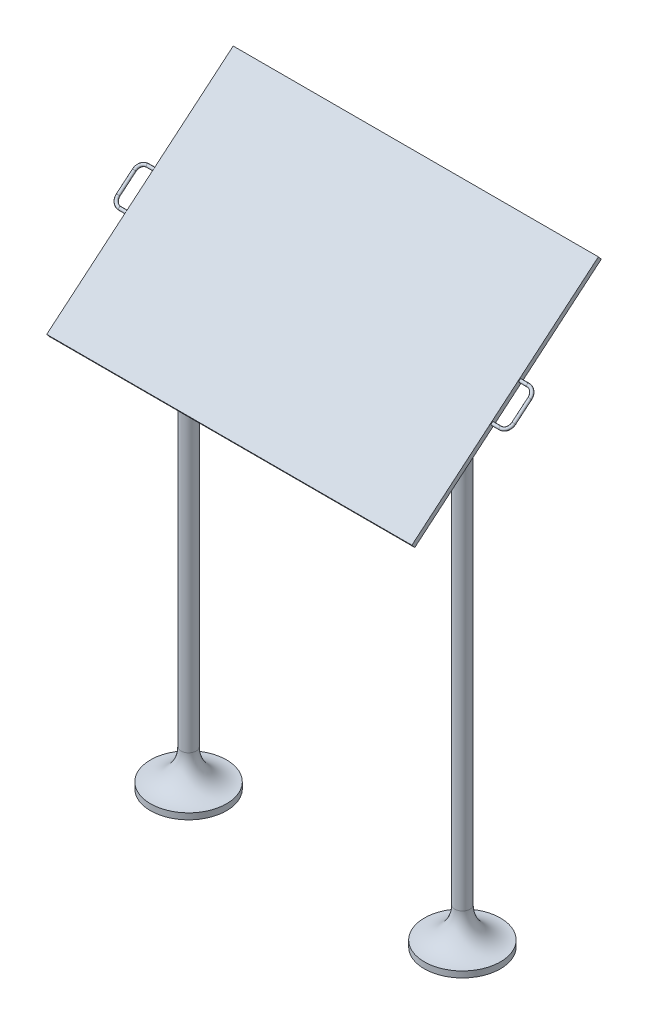
ISO-10303-21;
HEADER;
FILE_DESCRIPTION(('STEP AP214'),'2;1');
FILE_NAME('part.step','',(''),(''),'','','');
FILE_SCHEMA(('AUTOMOTIVE_DESIGN { 1 0 10303 214 1 1 1 1 }'));
ENDSEC;
DATA;
#1=APPLICATION_CONTEXT('core data for automotive mechanical design processes');
#2=APPLICATION_PROTOCOL_DEFINITION('international standard','automotive_design',2000,#1);
#3=PRODUCT_CONTEXT('',#1,'mechanical');
#4=PRODUCT('Part','Part','',(#3));
#5=PRODUCT_RELATED_PRODUCT_CATEGORY('part','',(#4));
#6=PRODUCT_DEFINITION_FORMATION('','',#4);
#7=PRODUCT_DEFINITION_CONTEXT('part definition',#1,'design');
#8=PRODUCT_DEFINITION('design','',#6,#7);
#9=PRODUCT_DEFINITION_SHAPE('','',#8);
#10=(LENGTH_UNIT() NAMED_UNIT(*) SI_UNIT(.MILLI.,.METRE.));
#11=(NAMED_UNIT(*) PLANE_ANGLE_UNIT() SI_UNIT($,.RADIAN.));
#12=(NAMED_UNIT(*) SI_UNIT($,.STERADIAN.) SOLID_ANGLE_UNIT());
#13=UNCERTAINTY_MEASURE_WITH_UNIT(LENGTH_MEASURE(1.E-05),#10,'distance_accuracy_value','');
#14=(GEOMETRIC_REPRESENTATION_CONTEXT(3) GLOBAL_UNCERTAINTY_ASSIGNED_CONTEXT((#13)) GLOBAL_UNIT_ASSIGNED_CONTEXT((#10,
#11,#12)) REPRESENTATION_CONTEXT('',''));
#15=CARTESIAN_POINT('',(0.,0.,0.));
#16=DIRECTION('',(0.,0.,1.));
#17=DIRECTION('',(1.,0.,0.));
#18=AXIS2_PLACEMENT_3D('',#15,#16,#17);
#19=CARTESIAN_POINT('',(-600.,0.,0.));
#20=DIRECTION('',(1.,0.,0.));
#21=DIRECTION('',(0.,0.,-1.));
#22=AXIS2_PLACEMENT_3D('',#19,#20,#21);
#23=PLANE('',#22);
#24=DIRECTION('',(0.,-0.76604444311899,-0.642787609686525));
#25=VECTOR('',#24,1.);
#26=CARTESIAN_POINT('',(-600.,1376.48813199274,316.059591392889));
#27=LINE('',#26,#25);
#28=CARTESIAN_POINT('',(-600.,1376.48813199274,316.059591392889));
#29=VERTEX_POINT('',#28);
#30=CARTESIAN_POINT('',(-600.,1364.99746534595,306.417777247591));
#31=VERTEX_POINT('',#30);
#32=EDGE_CURVE('E113',#29,#31,#27,.T.);
#33=ORIENTED_EDGE('',*,*,#32,.F.);
#34=DIRECTION('',(0.,-0.642787609686539,0.766044443118978));
#35=VECTOR('',#34,1.);
#36=CARTESIAN_POINT('',(-600.,1890.71821974197,-296.775963102293));
#37=LINE('',#36,#35);
#38=CARTESIAN_POINT('',(-600.,1890.71821974197,-296.775963102293));
#39=VERTEX_POINT('',#38);
#40=EDGE_CURVE('E84',#39,#29,#37,.T.);
#41=ORIENTED_EDGE('',*,*,#40,.F.);
#42=DIRECTION('',(0.,0.766044443118967,0.642787609686553));
#43=VECTOR('',#42,1.);
#44=CARTESIAN_POINT('',(-600.,1879.22755309518,-306.417777247591));
#45=LINE('',#44,#43);
#46=CARTESIAN_POINT('',(-600.,1879.22755309518,-306.417777247591));
#47=VERTEX_POINT('',#46);
#48=EDGE_CURVE('E78',#47,#39,#45,.T.);
#49=ORIENTED_EDGE('',*,*,#48,.F.);
#50=DIRECTION('',(0.,0.642787609686539,-0.766044443118978));
#51=VECTOR('',#50,1.);
#52=CARTESIAN_POINT('',(-600.,1364.99746534595,306.417777247591));
#53=LINE('',#52,#51);
#54=EDGE_CURVE('E103',#31,#47,#53,.T.);
#55=ORIENTED_EDGE('',*,*,#54,.F.);
#56=EDGE_LOOP('',(#33,#41,#49,#55));
#57=FACE_BOUND('',#56,.T.);
#58=CARTESIAN_POINT('',(-600.,1666.12260616791,-40.7812624459561));
#59=DIRECTION('',(1.,0.,0.));
#60=DIRECTION('',(0.,0.,-1.));
#61=AXIS2_PLACEMENT_3D('',#58,#59,#60);
#62=CIRCLE('',#61,5.00000000000012);
#63=CARTESIAN_POINT('',(-600.,1666.12260616791,-45.7812624459562));
#64=VERTEX_POINT('',#63);
#65=EDGE_CURVE('E281',#64,#64,#62,.T.);
#66=ORIENTED_EDGE('',*,*,#65,.T.);
#67=EDGE_LOOP('',(#66));
#68=FACE_BOUND('',#67,.T.);
#69=CARTESIAN_POINT('',(-600.,1589.59307892002,50.4230765912542));
#70=DIRECTION('',(1.,0.,0.));
#71=DIRECTION('',(0.,0.,-1.));
#72=AXIS2_PLACEMENT_3D('',#69,#70,#71);
#73=CIRCLE('',#72,5.00000000000012);
#74=CARTESIAN_POINT('',(-600.,1589.59307892002,45.423076591254));
#75=VERTEX_POINT('',#74);
#76=EDGE_CURVE('E12',#75,#75,#73,.F.);
#77=ORIENTED_EDGE('',*,*,#76,.F.);
#78=EDGE_LOOP('',(#77));
#79=FACE_BOUND('',#78,.T.);
#80=ADVANCED_FACE('F44',(#57,#68,#79),#23,.F.);
#81=CARTESIAN_POINT('',(600.,0.,0.));
#82=DIRECTION('',(1.,0.,0.));
#83=DIRECTION('',(0.,0.,-1.));
#84=AXIS2_PLACEMENT_3D('',#81,#82,#83);
#85=PLANE('',#84);
#86=CARTESIAN_POINT('',(600.,1589.59307892002,50.4230765912542));
#87=DIRECTION('',(1.,0.,0.));
#88=DIRECTION('',(0.,0.,-1.));
#89=AXIS2_PLACEMENT_3D('',#86,#87,#88);
#90=CIRCLE('',#89,5.00000000000012);
#91=CARTESIAN_POINT('',(600.,1589.59307892002,45.423076591254));
#92=VERTEX_POINT('',#91);
#93=EDGE_CURVE('E53',#92,#92,#90,.T.);
#94=ORIENTED_EDGE('',*,*,#93,.F.);
#95=EDGE_LOOP('',(#94));
#96=FACE_BOUND('',#95,.T.);
#97=DIRECTION('',(0.,-0.76604444311899,-0.642787609686525));
#98=VECTOR('',#97,1.);
#99=CARTESIAN_POINT('',(600.,1376.48813199274,316.059591392889));
#100=LINE('',#99,#98);
#101=CARTESIAN_POINT('',(600.,1376.48813199274,316.059591392889));
#102=VERTEX_POINT('',#101);
#103=CARTESIAN_POINT('',(600.,1364.99746534595,306.417777247591));
#104=VERTEX_POINT('',#103);
#105=EDGE_CURVE('E98',#102,#104,#100,.T.);
#106=ORIENTED_EDGE('',*,*,#105,.T.);
#107=DIRECTION('',(0.,0.642787609686539,-0.766044443118978));
#108=VECTOR('',#107,1.);
#109=CARTESIAN_POINT('',(600.,1364.99746534595,306.417777247591));
#110=LINE('',#109,#108);
#111=CARTESIAN_POINT('',(600.,1879.22755309518,-306.417777247591));
#112=VERTEX_POINT('',#111);
#113=EDGE_CURVE('E92',#104,#112,#110,.T.);
#114=ORIENTED_EDGE('',*,*,#113,.T.);
#115=DIRECTION('',(0.,0.766044443118967,0.642787609686553));
#116=VECTOR('',#115,1.);
#117=CARTESIAN_POINT('',(600.,1879.22755309518,-306.417777247591));
#118=LINE('',#117,#116);
#119=CARTESIAN_POINT('',(600.,1890.71821974197,-296.775963102293));
#120=VERTEX_POINT('',#119);
#121=EDGE_CURVE('E96',#112,#120,#118,.T.);
#122=ORIENTED_EDGE('',*,*,#121,.T.);
#123=DIRECTION('',(0.,-0.642787609686539,0.766044443118978));
#124=VECTOR('',#123,1.);
#125=CARTESIAN_POINT('',(600.,1890.71821974197,-296.775963102293));
#126=LINE('',#125,#124);
#127=EDGE_CURVE('E61',#120,#102,#126,.T.);
#128=ORIENTED_EDGE('',*,*,#127,.T.);
#129=EDGE_LOOP('',(#106,#114,#122,#128));
#130=FACE_BOUND('',#129,.T.);
#131=CARTESIAN_POINT('',(600.,1666.12260616791,-40.7812624459561));
#132=DIRECTION('',(1.,0.,0.));
#133=DIRECTION('',(0.,0.,-1.));
#134=AXIS2_PLACEMENT_3D('',#131,#132,#133);
#135=CIRCLE('',#134,5.00000000000012);
#136=CARTESIAN_POINT('',(600.,1666.12260616791,-45.7812624459562));
#137=VERTEX_POINT('',#136);
#138=EDGE_CURVE('E295',#137,#137,#135,.T.);
#139=ORIENTED_EDGE('',*,*,#138,.F.);
#140=EDGE_LOOP('',(#139));
#141=FACE_BOUND('',#140,.T.);
#142=ADVANCED_FACE('F93',(#96,#130,#141),#85,.T.);
#143=CARTESIAN_POINT('',(600.,1376.48813199274,316.059591392889));
#144=DIRECTION('',(0.,0.642787609686525,-0.76604444311899));
#145=DIRECTION('',(0.,0.76604444311899,0.642787609686525));
#146=AXIS2_PLACEMENT_3D('',#143,#144,#145);
#147=PLANE('',#146);
#148=ORIENTED_EDGE('',*,*,#32,.T.);
#149=DIRECTION('',(-1.,0.,0.));
#150=VECTOR('',#149,1.);
#151=CARTESIAN_POINT('',(600.,1364.99746534595,306.417777247591));
#152=LINE('',#151,#150);
#153=EDGE_CURVE('E104',#104,#31,#152,.T.);
#154=ORIENTED_EDGE('',*,*,#153,.F.);
#155=ORIENTED_EDGE('',*,*,#105,.F.);
#156=DIRECTION('',(-1.,0.,0.));
#157=VECTOR('',#156,1.);
#158=CARTESIAN_POINT('',(600.,1376.48813199274,316.059591392889));
#159=LINE('',#158,#157);
#160=EDGE_CURVE('E109',#102,#29,#159,.T.);
#161=ORIENTED_EDGE('',*,*,#160,.T.);
#162=EDGE_LOOP('',(#148,#154,#155,#161));
#163=FACE_BOUND('',#162,.T.);
#164=ADVANCED_FACE('F46',(#163),#147,.F.);
#165=CARTESIAN_POINT('',(600.,1364.99746534595,306.417777247591));
#166=DIRECTION('',(0.,0.766044443118978,0.64278760968654));
#167=DIRECTION('',(0.,-0.64278760968654,0.766044443118978));
#168=AXIS2_PLACEMENT_3D('',#165,#166,#167);
#169=PLANE('',#168);
#170=ORIENTED_EDGE('',*,*,#54,.T.);
#171=DIRECTION('',(-1.,0.,0.));
#172=VECTOR('',#171,1.);
#173=CARTESIAN_POINT('',(600.,1879.22755309518,-306.417777247591));
#174=LINE('',#173,#172);
#175=EDGE_CURVE('E101',#112,#47,#174,.T.);
#176=ORIENTED_EDGE('',*,*,#175,.F.);
#177=ORIENTED_EDGE('',*,*,#113,.F.);
#178=ORIENTED_EDGE('',*,*,#153,.T.);
#179=EDGE_LOOP('',(#170,#176,#177,#178));
#180=FACE_BOUND('',#179,.T.);
#181=ADVANCED_FACE('F102',(#180),#169,.F.);
#182=CARTESIAN_POINT('',(600.,1879.22755309518,-306.417777247591));
#183=DIRECTION('',(0.,-0.642787609686553,0.766044443118967));
#184=DIRECTION('',(0.,-0.766044443118967,-0.642787609686553));
#185=AXIS2_PLACEMENT_3D('',#182,#183,#184);
#186=PLANE('',#185);
#187=ORIENTED_EDGE('',*,*,#48,.T.);
#188=DIRECTION('',(-1.,0.,0.));
#189=VECTOR('',#188,1.);
#190=CARTESIAN_POINT('',(600.,1890.71821974197,-296.775963102293));
#191=LINE('',#190,#189);
#192=EDGE_CURVE('E105',#120,#39,#191,.T.);
#193=ORIENTED_EDGE('',*,*,#192,.F.);
#194=ORIENTED_EDGE('',*,*,#121,.F.);
#195=ORIENTED_EDGE('',*,*,#175,.T.);
#196=EDGE_LOOP('',(#187,#193,#194,#195));
#197=FACE_BOUND('',#196,.T.);
#198=ADVANCED_FACE('F107',(#197),#186,.F.);
#199=CARTESIAN_POINT('',(600.,1890.71821974197,-296.775963102293));
#200=DIRECTION('',(0.,-0.766044443118978,-0.642787609686539));
#201=DIRECTION('',(0.,0.642787609686539,-0.766044443118978));
#202=AXIS2_PLACEMENT_3D('',#199,#200,#201);
#203=PLANE('',#202);
#204=ORIENTED_EDGE('',*,*,#40,.T.);
#205=ORIENTED_EDGE('',*,*,#160,.F.);
#206=ORIENTED_EDGE('',*,*,#127,.F.);
#207=ORIENTED_EDGE('',*,*,#192,.T.);
#208=EDGE_LOOP('',(#204,#205,#206,#207));
#209=FACE_BOUND('',#208,.T.);
#210=ADVANCED_FACE('F139',(#209),#203,.F.);
#211=CARTESIAN_POINT('',(625.,1589.59307892002,50.4230765912543));
#212=DIRECTION('',(-1.,0.,0.));
#213=DIRECTION('',(0.,0.,1.));
#214=AXIS2_PLACEMENT_3D('',#211,#212,#213);
#215=CYLINDRICAL_SURFACE('',#214,5.00000000000012);
#216=CARTESIAN_POINT('',(625.,1589.59307892002,50.4230765912543));
#217=DIRECTION('',(-1.,0.,0.));
#218=DIRECTION('',(0.,-0.984807753012207,0.173648177666939));
#219=AXIS2_PLACEMENT_3D('',#216,#217,#218);
#220=CIRCLE('',#219,5.00000000000012);
#221=CARTESIAN_POINT('',(625.,1586.37914087158,54.2532988068493));
#222=VERTEX_POINT('',#221);
#223=EDGE_CURVE('E116',#222,#222,#220,.T.);
#224=ORIENTED_EDGE('',*,*,#223,.T.);
#225=EDGE_LOOP('',(#224));
#226=FACE_BOUND('',#225,.T.);
#227=ORIENTED_EDGE('',*,*,#93,.T.);
#228=EDGE_LOOP('',(#227));
#229=FACE_BOUND('',#228,.T.);
#230=ADVANCED_FACE('F125',(#226,#229),#215,.T.);
#231=CARTESIAN_POINT('',(625.,1605.66276916218,31.2719655132799));
#232=DIRECTION('',(0.,-0.766044443118981,-0.642787609686536));
#233=DIRECTION('',(0.,0.642787609686536,-0.766044443118981));
#234=AXIS2_PLACEMENT_3D('',#231,#232,#233);
#235=TOROIDAL_SURFACE('',#234,24.9999999999998,5.00000000000012);
#236=CARTESIAN_POINT('',(650.,1605.66276916218,31.2719655132799));
#237=DIRECTION('',(0.,-0.642787609686536,0.766044443118981));
#238=DIRECTION('',(0.766044443118981,-0.492403876506103,-0.41317591116653));
#239=AXIS2_PLACEMENT_3D('',#236,#237,#238);
#240=CIRCLE('',#239,5.00000000000012);
#241=CARTESIAN_POINT('',(655.,1605.66276916218,31.2719655132799));
#242=VERTEX_POINT('',#241);
#243=EDGE_CURVE('E304',#242,#242,#240,.T.);
#244=CARTESIAN_POINT('',(625.,1605.66276916218,31.2719655132799));
#245=DIRECTION('',(0.,-0.766044443118981,-0.642787609686536));
#246=DIRECTION('',(0.,0.642787609686536,-0.766044443118981));
#247=AXIS2_PLACEMENT_3D('',#244,#245,#246);
#248=CIRCLE('',#247,29.9999999999999);
#249=EDGE_CURVE('',#242,#222,#248,.T.);
#250=ORIENTED_EDGE('',*,*,#243,.T.);
#251=ORIENTED_EDGE('',*,*,#223,.F.);
#252=ORIENTED_EDGE('',*,*,#249,.T.);
#253=ORIENTED_EDGE('',*,*,#249,.F.);
#254=EDGE_LOOP('',(#250,#252,#251,#253));
#255=FACE_BOUND('',#254,.T.);
#256=ADVANCED_FACE('F162',(#255),#235,.T.);
#257=CARTESIAN_POINT('',(650.,1650.05291592574,-21.6301513679817));
#258=DIRECTION('',(0.,-0.642787609686536,0.766044443118981));
#259=DIRECTION('',(0.,-0.766044443118981,-0.642787609686536));
#260=AXIS2_PLACEMENT_3D('',#257,#258,#259);
#261=CYLINDRICAL_SURFACE('',#260,5.00000000000012);
#262=CARTESIAN_POINT('',(650.,1650.05291592574,-21.6301513679817));
#263=DIRECTION('',(0.,-0.642787609686536,0.766044443118981));
#264=DIRECTION('',(0.766044443118981,-0.492403876506103,-0.41317591116653));
#265=AXIS2_PLACEMENT_3D('',#262,#263,#264);
#266=CIRCLE('',#265,5.00000000000012);
#267=CARTESIAN_POINT('',(655.,1650.05291592574,-21.6301513679817));
#268=VERTEX_POINT('',#267);
#269=EDGE_CURVE('E299',#268,#268,#266,.T.);
#270=ORIENTED_EDGE('',*,*,#269,.T.);
#271=EDGE_LOOP('',(#270));
#272=FACE_BOUND('',#271,.T.);
#273=ORIENTED_EDGE('',*,*,#243,.F.);
#274=EDGE_LOOP('',(#273));
#275=FACE_BOUND('',#274,.T.);
#276=ADVANCED_FACE('F169',(#272,#275),#261,.T.);
#277=CARTESIAN_POINT('',(625.,1650.05291592574,-21.6301513679818));
#278=DIRECTION('',(0.,-0.766044443118981,-0.642787609686536));
#279=DIRECTION('',(0.,0.642787609686536,-0.766044443118981));
#280=AXIS2_PLACEMENT_3D('',#277,#278,#279);
#281=TOROIDAL_SURFACE('',#280,24.9999999999998,5.00000000000012);
#282=CARTESIAN_POINT('',(625.,1666.12260616791,-40.7812624459562));
#283=DIRECTION('',(1.,0.,0.));
#284=DIRECTION('',(0.,0.,-1.));
#285=AXIS2_PLACEMENT_3D('',#282,#283,#284);
#286=CIRCLE('',#285,5.00000000000012);
#287=CARTESIAN_POINT('',(625.,1669.33654421634,-44.6114846615512));
#288=VERTEX_POINT('',#287);
#289=EDGE_CURVE('E296',#288,#288,#286,.T.);
#290=CARTESIAN_POINT('',(625.,1650.05291592574,-21.6301513679818));
#291=DIRECTION('',(0.,-0.766044443118981,-0.642787609686536));
#292=DIRECTION('',(0.,0.642787609686536,-0.766044443118981));
#293=AXIS2_PLACEMENT_3D('',#290,#291,#292);
#294=CIRCLE('',#293,30.);
#295=EDGE_CURVE('',#288,#268,#294,.T.);
#296=ORIENTED_EDGE('',*,*,#289,.T.);
#297=ORIENTED_EDGE('',*,*,#269,.F.);
#298=ORIENTED_EDGE('',*,*,#295,.T.);
#299=ORIENTED_EDGE('',*,*,#295,.F.);
#300=EDGE_LOOP('',(#296,#298,#297,#299));
#301=FACE_BOUND('',#300,.T.);
#302=ADVANCED_FACE('F176',(#301),#281,.T.);
#303=CARTESIAN_POINT('',(625.,1666.12260616791,-40.7812624459562));
#304=DIRECTION('',(-1.,0.,0.));
#305=DIRECTION('',(0.,-1.,0.));
#306=AXIS2_PLACEMENT_3D('',#303,#304,#305);
#307=CYLINDRICAL_SURFACE('',#306,5.00000000000012);
#308=ORIENTED_EDGE('',*,*,#289,.F.);
#309=EDGE_LOOP('',(#308));
#310=FACE_BOUND('',#309,.T.);
#311=ORIENTED_EDGE('',*,*,#138,.T.);
#312=EDGE_LOOP('',(#311));
#313=FACE_BOUND('',#312,.T.);
#314=ADVANCED_FACE('F184',(#310,#313),#307,.T.);
#315=CARTESIAN_POINT('',(-625.,1589.59307892002,50.4230765912543));
#316=DIRECTION('',(1.,0.,0.));
#317=DIRECTION('',(0.,0.,-1.));
#318=AXIS2_PLACEMENT_3D('',#315,#316,#317);
#319=CYLINDRICAL_SURFACE('',#318,5.00000000000012);
#320=CARTESIAN_POINT('',(-625.,1589.59307892002,50.4230765912543));
#321=DIRECTION('',(-1.,0.,0.));
#322=DIRECTION('',(0.,-0.984807753012207,0.173648177666939));
#323=AXIS2_PLACEMENT_3D('',#320,#321,#322);
#324=CIRCLE('',#323,5.00000000000012);
#325=CARTESIAN_POINT('',(-625.,1586.37914087158,54.2532988068493));
#326=VERTEX_POINT('',#325);
#327=EDGE_CURVE('E292',#326,#326,#324,.T.);
#328=ORIENTED_EDGE('',*,*,#327,.F.);
#329=EDGE_LOOP('',(#328));
#330=FACE_BOUND('',#329,.T.);
#331=ORIENTED_EDGE('',*,*,#76,.T.);
#332=EDGE_LOOP('',(#331));
#333=FACE_BOUND('',#332,.T.);
#334=ADVANCED_FACE('F192',(#330,#333),#319,.T.);
#335=CARTESIAN_POINT('',(-625.,1605.66276916218,31.2719655132799));
#336=DIRECTION('',(0.,0.766044443118981,0.642787609686536));
#337=DIRECTION('',(0.,-0.642787609686536,0.766044443118981));
#338=AXIS2_PLACEMENT_3D('',#335,#336,#337);
#339=TOROIDAL_SURFACE('',#338,24.9999999999998,5.00000000000012);
#340=CARTESIAN_POINT('',(-650.,1605.66276916218,31.2719655132799));
#341=DIRECTION('',(0.,0.642787609686536,-0.766044443118981));
#342=DIRECTION('',(-0.766044443118981,-0.492403876506103,-0.41317591116653));
#343=AXIS2_PLACEMENT_3D('',#340,#341,#342);
#344=CIRCLE('',#343,5.00000000000012);
#345=CARTESIAN_POINT('',(-655.,1605.66276916218,31.2719655132799));
#346=VERTEX_POINT('',#345);
#347=EDGE_CURVE('E289',#346,#346,#344,.T.);
#348=CARTESIAN_POINT('',(-625.,1605.66276916218,31.2719655132799));
#349=DIRECTION('',(0.,0.766044443118981,0.642787609686536));
#350=DIRECTION('',(0.,-0.642787609686536,0.766044443118981));
#351=AXIS2_PLACEMENT_3D('',#348,#349,#350);
#352=CIRCLE('',#351,29.9999999999999);
#353=EDGE_CURVE('',#346,#326,#352,.T.);
#354=ORIENTED_EDGE('',*,*,#347,.F.);
#355=ORIENTED_EDGE('',*,*,#327,.T.);
#356=ORIENTED_EDGE('',*,*,#353,.T.);
#357=ORIENTED_EDGE('',*,*,#353,.F.);
#358=EDGE_LOOP('',(#354,#356,#355,#357));
#359=FACE_BOUND('',#358,.T.);
#360=ADVANCED_FACE('F201',(#359),#339,.T.);
#361=CARTESIAN_POINT('',(-650.,1650.05291592574,-21.6301513679817));
#362=DIRECTION('',(0.,-0.642787609686536,0.766044443118981));
#363=DIRECTION('',(0.,-0.766044443118981,-0.642787609686536));
#364=AXIS2_PLACEMENT_3D('',#361,#362,#363);
#365=CYLINDRICAL_SURFACE('',#364,5.00000000000012);
#366=CARTESIAN_POINT('',(-650.,1650.05291592574,-21.6301513679817));
#367=DIRECTION('',(0.,0.642787609686536,-0.766044443118981));
#368=DIRECTION('',(-0.766044443118981,-0.492403876506103,-0.41317591116653));
#369=AXIS2_PLACEMENT_3D('',#366,#367,#368);
#370=CIRCLE('',#369,5.00000000000012);
#371=CARTESIAN_POINT('',(-655.,1650.05291592574,-21.6301513679817));
#372=VERTEX_POINT('',#371);
#373=EDGE_CURVE('E284',#372,#372,#370,.T.);
#374=ORIENTED_EDGE('',*,*,#373,.F.);
#375=EDGE_LOOP('',(#374));
#376=FACE_BOUND('',#375,.T.);
#377=ORIENTED_EDGE('',*,*,#347,.T.);
#378=EDGE_LOOP('',(#377));
#379=FACE_BOUND('',#378,.T.);
#380=ADVANCED_FACE('F209',(#376,#379),#365,.T.);
#381=CARTESIAN_POINT('',(-625.,1650.05291592574,-21.6301513679818));
#382=DIRECTION('',(0.,0.766044443118981,0.642787609686536));
#383=DIRECTION('',(0.,-0.642787609686536,0.766044443118981));
#384=AXIS2_PLACEMENT_3D('',#381,#382,#383);
#385=TOROIDAL_SURFACE('',#384,24.9999999999998,5.00000000000012);
#386=CARTESIAN_POINT('',(-625.,1666.12260616791,-40.7812624459562));
#387=DIRECTION('',(1.,0.,0.));
#388=DIRECTION('',(0.,0.,-1.));
#389=AXIS2_PLACEMENT_3D('',#386,#387,#388);
#390=CIRCLE('',#389,5.00000000000012);
#391=CARTESIAN_POINT('',(-625.,1669.33654421634,-44.6114846615512));
#392=VERTEX_POINT('',#391);
#393=EDGE_CURVE('E278',#392,#392,#390,.T.);
#394=CARTESIAN_POINT('',(-625.,1650.05291592574,-21.6301513679818));
#395=DIRECTION('',(0.,0.766044443118981,0.642787609686536));
#396=DIRECTION('',(0.,-0.642787609686536,0.766044443118981));
#397=AXIS2_PLACEMENT_3D('',#394,#395,#396);
#398=CIRCLE('',#397,30.);
#399=EDGE_CURVE('',#392,#372,#398,.T.);
#400=ORIENTED_EDGE('',*,*,#393,.F.);
#401=ORIENTED_EDGE('',*,*,#373,.T.);
#402=ORIENTED_EDGE('',*,*,#399,.T.);
#403=ORIENTED_EDGE('',*,*,#399,.F.);
#404=EDGE_LOOP('',(#400,#402,#401,#403));
#405=FACE_BOUND('',#404,.T.);
#406=ADVANCED_FACE('F217',(#405),#385,.T.);
#407=CARTESIAN_POINT('',(-625.,1666.12260616791,-40.7812624459562));
#408=DIRECTION('',(1.,0.,0.));
#409=DIRECTION('',(0.,1.,0.));
#410=AXIS2_PLACEMENT_3D('',#407,#408,#409);
#411=CYLINDRICAL_SURFACE('',#410,5.00000000000012);
#412=ORIENTED_EDGE('',*,*,#393,.T.);
#413=EDGE_LOOP('',(#412));
#414=FACE_BOUND('',#413,.T.);
#415=ORIENTED_EDGE('',*,*,#65,.F.);
#416=EDGE_LOOP('',(#415));
#417=FACE_BOUND('',#416,.T.);
#418=ADVANCED_FACE('F225',(#414,#417),#411,.T.);
#419=CLOSED_SHELL('',(#80,#142,#164,#181,#198,#210,#230,#256,#276,#302,#314,#334,#360,#380,#406,#418));
#420=MANIFOLD_SOLID_BREP('B2',#419);
#421=CARTESIAN_POINT('',(450.,20.,0.));
#422=DIRECTION('',(0.,-1.,0.));
#423=DIRECTION('',(0.,0.,-1.));
#424=AXIS2_PLACEMENT_3D('',#421,#422,#423);
#425=CYLINDRICAL_SURFACE('',#424,125.);
#426=CARTESIAN_POINT('',(450.,20.,0.));
#427=DIRECTION('',(0.,1.,0.));
#428=DIRECTION('',(0.,0.,-1.));
#429=AXIS2_PLACEMENT_3D('',#426,#427,#428);
#430=CIRCLE('',#429,125.);
#431=CARTESIAN_POINT('',(450.,20.,-125.));
#432=VERTEX_POINT('',#431);
#433=EDGE_CURVE('E344',#432,#432,#430,.T.);
#434=ORIENTED_EDGE('',*,*,#433,.F.);
#435=EDGE_LOOP('',(#434));
#436=FACE_BOUND('',#435,.T.);
#437=CARTESIAN_POINT('',(450.,0.,0.));
#438=DIRECTION('',(0.,1.,0.));
#439=DIRECTION('',(0.,0.,-1.));
#440=AXIS2_PLACEMENT_3D('',#437,#438,#439);
#441=CIRCLE('',#440,125.);
#442=CARTESIAN_POINT('',(450.,0.,-125.));
#443=VERTEX_POINT('',#442);
#444=EDGE_CURVE('E348',#443,#443,#441,.T.);
#445=ORIENTED_EDGE('',*,*,#444,.T.);
#446=EDGE_LOOP('',(#445));
#447=FACE_BOUND('',#446,.T.);
#448=ADVANCED_FACE('F337',(#436,#447),#425,.T.);
#449=CARTESIAN_POINT('',(450.,0.,0.));
#450=DIRECTION('',(0.,-1.,0.));
#451=DIRECTION('',(0.,0.,-1.));
#452=AXIS2_PLACEMENT_3D('',#449,#450,#451);
#453=PLANE('',#452);
#454=ORIENTED_EDGE('',*,*,#444,.F.);
#455=EDGE_LOOP('',(#454));
#456=FACE_BOUND('',#455,.T.);
#457=ADVANCED_FACE('F368',(#456),#453,.T.);
#458=CARTESIAN_POINT('',(450.,1643.09,0.));
#459=DIRECTION('',(0.,-1.,0.));
#460=DIRECTION('',(0.,0.,-1.));
#461=AXIS2_PLACEMENT_3D('',#458,#459,#460);
#462=CYLINDRICAL_SURFACE('',#461,25.);
#463=CARTESIAN_POINT('',(450.,120.000000000001,0.));
#464=DIRECTION('',(0.,-1.,0.));
#465=DIRECTION('',(0.,0.,-1.));
#466=AXIS2_PLACEMENT_3D('',#463,#464,#465);
#467=CIRCLE('',#466,25.);
#468=CARTESIAN_POINT('',(450.,120.000000000001,-25.));
#469=VERTEX_POINT('',#468);
#470=EDGE_CURVE('E43',#469,#469,#467,.F.);
#471=ORIENTED_EDGE('',*,*,#470,.T.);
#472=EDGE_LOOP('',(#471));
#473=FACE_BOUND('',#472,.T.);
#474=CARTESIAN_POINT('',(450.,1622.11250922057,0.));
#475=DIRECTION('',(0.,-0.76604444311898,-0.642787609686537));
#476=DIRECTION('',(0.,-0.642787609686537,0.76604444311898));
#477=AXIS2_PLACEMENT_3D('',#474,#475,#476);
#478=ELLIPSE('',#477,32.6351822333069,25.);
#479=CARTESIAN_POINT('',(450.,1601.13501844114,25.));
#480=VERTEX_POINT('',#479);
#481=EDGE_CURVE('E353',#480,#480,#478,.T.);
#482=ORIENTED_EDGE('',*,*,#481,.T.);
#483=EDGE_LOOP('',(#482));
#484=FACE_BOUND('',#483,.T.);
#485=ADVANCED_FACE('F358',(#473,#484),#462,.T.);
#486=CARTESIAN_POINT('',(450.,120.,0.));
#487=DIRECTION('',(0.,-1.,0.));
#488=DIRECTION('',(0.,0.,-1.));
#489=AXIS2_PLACEMENT_3D('',#486,#487,#488);
#490=TOROIDAL_SURFACE('',#489,125.,100.);
#491=ORIENTED_EDGE('',*,*,#433,.T.);
#492=EDGE_LOOP('',(#491));
#493=FACE_BOUND('',#492,.T.);
#494=ORIENTED_EDGE('',*,*,#470,.F.);
#495=EDGE_LOOP('',(#494));
#496=FACE_BOUND('',#495,.T.);
#497=ADVANCED_FACE('F339',(#493,#496),#490,.F.);
#498=CARTESIAN_POINT('',(-575.,1643.09,-25.));
#499=DIRECTION('',(0.,-0.76604444311898,-0.642787609686537));
#500=DIRECTION('',(0.,0.642787609686537,-0.76604444311898));
#501=AXIS2_PLACEMENT_3D('',#498,#499,#500);
#502=PLANE('',#501);
#503=ORIENTED_EDGE('',*,*,#481,.F.);
#504=EDGE_LOOP('',(#503));
#505=FACE_BOUND('',#504,.T.);
#506=ADVANCED_FACE('F360',(#505),#502,.F.);
#507=CLOSED_SHELL('',(#448,#457,#485,#497,#506));
#508=MANIFOLD_SOLID_BREP('B6',#507);
#509=CARTESIAN_POINT('',(-450.,20.,0.));
#510=DIRECTION('',(0.,-1.,0.));
#511=DIRECTION('',(0.,0.,-1.));
#512=AXIS2_PLACEMENT_3D('',#509,#510,#511);
#513=CYLINDRICAL_SURFACE('',#512,125.);
#514=CARTESIAN_POINT('',(-450.,20.,0.));
#515=DIRECTION('',(0.,1.,0.));
#516=DIRECTION('',(0.,0.,1.));
#517=AXIS2_PLACEMENT_3D('',#514,#515,#516);
#518=CIRCLE('',#517,125.);
#519=CARTESIAN_POINT('',(-450.,20.,125.));
#520=VERTEX_POINT('',#519);
#521=EDGE_CURVE('E415',#520,#520,#518,.T.);
#522=ORIENTED_EDGE('',*,*,#521,.F.);
#523=EDGE_LOOP('',(#522));
#524=FACE_BOUND('',#523,.T.);
#525=CARTESIAN_POINT('',(-450.,0.,0.));
#526=DIRECTION('',(0.,1.,0.));
#527=DIRECTION('',(0.,0.,1.));
#528=AXIS2_PLACEMENT_3D('',#525,#526,#527);
#529=CIRCLE('',#528,125.);
#530=CARTESIAN_POINT('',(-450.,0.,125.));
#531=VERTEX_POINT('',#530);
#532=EDGE_CURVE('E419',#531,#531,#529,.T.);
#533=ORIENTED_EDGE('',*,*,#532,.T.);
#534=EDGE_LOOP('',(#533));
#535=FACE_BOUND('',#534,.T.);
#536=ADVANCED_FACE('F408',(#524,#535),#513,.T.);
#537=CARTESIAN_POINT('',(-450.,0.,0.));
#538=DIRECTION('',(0.,1.,0.));
#539=DIRECTION('',(0.,0.,1.));
#540=AXIS2_PLACEMENT_3D('',#537,#538,#539);
#541=PLANE('',#540);
#542=ORIENTED_EDGE('',*,*,#532,.F.);
#543=EDGE_LOOP('',(#542));
#544=FACE_BOUND('',#543,.T.);
#545=ADVANCED_FACE('F439',(#544),#541,.F.);
#546=CARTESIAN_POINT('',(-450.,1643.09,0.));
#547=DIRECTION('',(0.,-1.,0.));
#548=DIRECTION('',(0.,0.,-1.));
#549=AXIS2_PLACEMENT_3D('',#546,#547,#548);
#550=CYLINDRICAL_SURFACE('',#549,25.);
#551=CARTESIAN_POINT('',(-450.,120.000000000001,0.));
#552=DIRECTION('',(0.,1.,0.));
#553=DIRECTION('',(0.,0.,1.));
#554=AXIS2_PLACEMENT_3D('',#551,#552,#553);
#555=CIRCLE('',#554,25.);
#556=CARTESIAN_POINT('',(-450.,120.000000000001,25.));
#557=VERTEX_POINT('',#556);
#558=EDGE_CURVE('E336',#557,#557,#555,.T.);
#559=ORIENTED_EDGE('',*,*,#558,.T.);
#560=EDGE_LOOP('',(#559));
#561=FACE_BOUND('',#560,.T.);
#562=CARTESIAN_POINT('',(-450.,1622.11250922057,0.));
#563=DIRECTION('',(0.,-0.76604444311898,-0.642787609686537));
#564=DIRECTION('',(0.,-0.642787609686537,0.76604444311898));
#565=AXIS2_PLACEMENT_3D('',#562,#563,#564);
#566=ELLIPSE('',#565,32.6351822333069,25.);
#567=CARTESIAN_POINT('',(-450.,1601.13501844114,25.));
#568=VERTEX_POINT('',#567);
#569=EDGE_CURVE('E424',#568,#568,#566,.T.);
#570=ORIENTED_EDGE('',*,*,#569,.T.);
#571=EDGE_LOOP('',(#570));
#572=FACE_BOUND('',#571,.T.);
#573=ADVANCED_FACE('F429',(#561,#572),#550,.T.);
#574=CARTESIAN_POINT('',(-450.,120.,0.));
#575=DIRECTION('',(0.,1.,0.));
#576=DIRECTION('',(0.,0.,1.));
#577=AXIS2_PLACEMENT_3D('',#574,#575,#576);
#578=TOROIDAL_SURFACE('',#577,125.,100.);
#579=ORIENTED_EDGE('',*,*,#521,.T.);
#580=EDGE_LOOP('',(#579));
#581=FACE_BOUND('',#580,.T.);
#582=ORIENTED_EDGE('',*,*,#558,.F.);
#583=EDGE_LOOP('',(#582));
#584=FACE_BOUND('',#583,.T.);
#585=ADVANCED_FACE('F410',(#581,#584),#578,.F.);
#586=CARTESIAN_POINT('',(-575.,1643.09,-25.));
#587=DIRECTION('',(0.,-0.76604444311898,-0.642787609686537));
#588=DIRECTION('',(0.,0.642787609686537,-0.76604444311898));
#589=AXIS2_PLACEMENT_3D('',#586,#587,#588);
#590=PLANE('',#589);
#591=ORIENTED_EDGE('',*,*,#569,.F.);
#592=EDGE_LOOP('',(#591));
#593=FACE_BOUND('',#592,.T.);
#594=ADVANCED_FACE('F431',(#593),#590,.F.);
#595=CLOSED_SHELL('',(#536,#545,#573,#585,#594));
#596=MANIFOLD_SOLID_BREP('B38',#595);
#597=ADVANCED_BREP_SHAPE_REPRESENTATION('',(#18,#420,#508,#596),#14);
#598=SHAPE_DEFINITION_REPRESENTATION(#9,#597);
ENDSEC;
END-ISO-10303-21;
